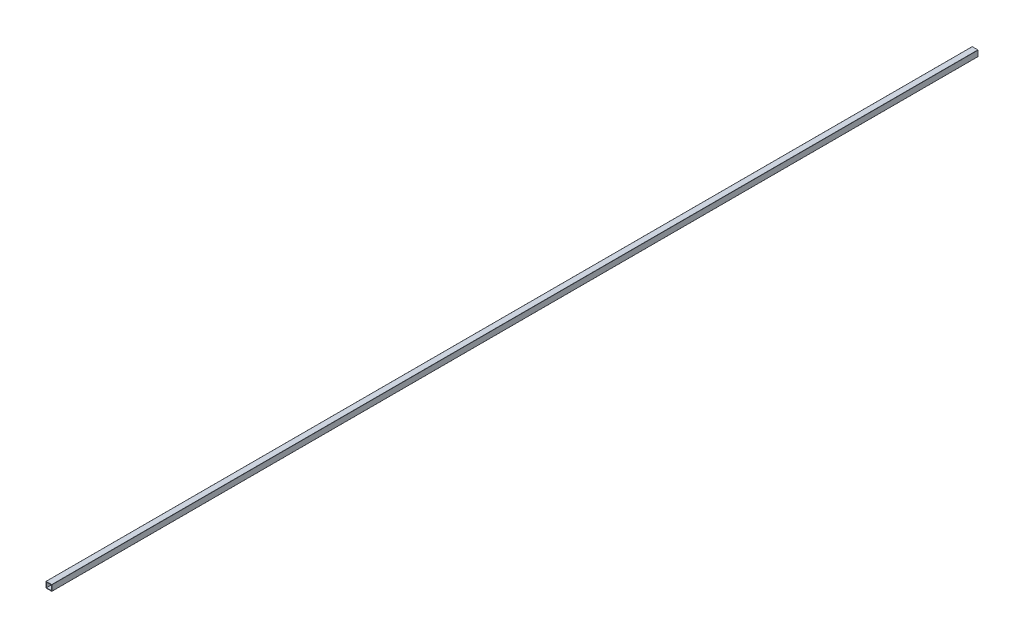
ISO-10303-21;
HEADER;
FILE_DESCRIPTION(('STEP AP214'),'2;1');
FILE_NAME('part.step','',(''),(''),'','','');
FILE_SCHEMA(('AUTOMOTIVE_DESIGN { 1 0 10303 214 1 1 1 1 }'));
ENDSEC;
DATA;
#1=APPLICATION_CONTEXT('core data for automotive mechanical design processes');
#2=APPLICATION_PROTOCOL_DEFINITION('international standard','automotive_design',2000,#1);
#3=PRODUCT_CONTEXT('',#1,'mechanical');
#4=PRODUCT('Part','Part','',(#3));
#5=PRODUCT_RELATED_PRODUCT_CATEGORY('part','',(#4));
#6=PRODUCT_DEFINITION_FORMATION('','',#4);
#7=PRODUCT_DEFINITION_CONTEXT('part definition',#1,'design');
#8=PRODUCT_DEFINITION('design','',#6,#7);
#9=PRODUCT_DEFINITION_SHAPE('','',#8);
#10=(LENGTH_UNIT() NAMED_UNIT(*) SI_UNIT(.MILLI.,.METRE.));
#11=(NAMED_UNIT(*) PLANE_ANGLE_UNIT() SI_UNIT($,.RADIAN.));
#12=(NAMED_UNIT(*) SI_UNIT($,.STERADIAN.) SOLID_ANGLE_UNIT());
#13=UNCERTAINTY_MEASURE_WITH_UNIT(LENGTH_MEASURE(1.E-05),#10,'distance_accuracy_value','');
#14=(GEOMETRIC_REPRESENTATION_CONTEXT(3) GLOBAL_UNCERTAINTY_ASSIGNED_CONTEXT((#13)) GLOBAL_UNIT_ASSIGNED_CONTEXT((#10,
#11,#12)) REPRESENTATION_CONTEXT('',''));
#15=CARTESIAN_POINT('',(0.,0.,0.));
#16=DIRECTION('',(0.,0.,1.));
#17=DIRECTION('',(1.,0.,0.));
#18=AXIS2_PLACEMENT_3D('',#15,#16,#17);
#19=CARTESIAN_POINT('',(18.05,18.05,6000.));
#20=DIRECTION('',(0.,0.,-1.));
#21=DIRECTION('',(-1.,0.,0.));
#22=AXIS2_PLACEMENT_3D('',#19,#20,#21);
#23=PLANE('',#22);
#24=CARTESIAN_POINT('',(18.05,18.05,6000.));
#25=DIRECTION('',(0.,0.,1.));
#26=DIRECTION('',(-1.,0.,0.));
#27=AXIS2_PLACEMENT_3D('',#24,#25,#26);
#28=CIRCLE('',#27,1.);
#29=CARTESIAN_POINT('',(19.05,18.05,6000.));
#30=VERTEX_POINT('',#29);
#31=CARTESIAN_POINT('',(18.05,19.05,6000.));
#32=VERTEX_POINT('',#31);
#33=EDGE_CURVE('E158',#30,#32,#28,.T.);
#34=ORIENTED_EDGE('',*,*,#33,.T.);
#35=DIRECTION('',(-1.,0.,0.));
#36=VECTOR('',#35,1.);
#37=CARTESIAN_POINT('',(-18.05,19.05,6000.));
#38=LINE('',#37,#36);
#39=CARTESIAN_POINT('',(-18.05,19.05,6000.));
#40=VERTEX_POINT('',#39);
#41=EDGE_CURVE('E161',#32,#40,#38,.T.);
#42=ORIENTED_EDGE('',*,*,#41,.T.);
#43=CARTESIAN_POINT('',(-18.05,18.05,6000.));
#44=DIRECTION('',(0.,0.,1.));
#45=DIRECTION('',(-1.,0.,0.));
#46=AXIS2_PLACEMENT_3D('',#43,#44,#45);
#47=CIRCLE('',#46,1.);
#48=CARTESIAN_POINT('',(-19.05,18.05,6000.));
#49=VERTEX_POINT('',#48);
#50=EDGE_CURVE('E164',#40,#49,#47,.T.);
#51=ORIENTED_EDGE('',*,*,#50,.T.);
#52=DIRECTION('',(0.,-1.,0.));
#53=VECTOR('',#52,1.);
#54=CARTESIAN_POINT('',(-19.05,-18.05,6000.));
#55=LINE('',#54,#53);
#56=CARTESIAN_POINT('',(-19.05,-18.05,6000.));
#57=VERTEX_POINT('',#56);
#58=EDGE_CURVE('E166',#49,#57,#55,.T.);
#59=ORIENTED_EDGE('',*,*,#58,.T.);
#60=CARTESIAN_POINT('',(-18.05,-18.05,6000.));
#61=DIRECTION('',(0.,0.,1.));
#62=DIRECTION('',(-1.,0.,0.));
#63=AXIS2_PLACEMENT_3D('',#60,#61,#62);
#64=CIRCLE('',#63,1.);
#65=CARTESIAN_POINT('',(-18.05,-19.05,6000.));
#66=VERTEX_POINT('',#65);
#67=EDGE_CURVE('E168',#57,#66,#64,.T.);
#68=ORIENTED_EDGE('',*,*,#67,.T.);
#69=DIRECTION('',(1.,0.,0.));
#70=VECTOR('',#69,1.);
#71=CARTESIAN_POINT('',(-18.05,-19.05,6000.));
#72=LINE('',#71,#70);
#73=CARTESIAN_POINT('',(18.05,-19.05,6000.));
#74=VERTEX_POINT('',#73);
#75=EDGE_CURVE('E170',#66,#74,#72,.T.);
#76=ORIENTED_EDGE('',*,*,#75,.T.);
#77=CARTESIAN_POINT('',(18.05,-18.05,6000.));
#78=DIRECTION('',(0.,0.,1.));
#79=DIRECTION('',(1.,0.,0.));
#80=AXIS2_PLACEMENT_3D('',#77,#78,#79);
#81=CIRCLE('',#80,1.);
#82=CARTESIAN_POINT('',(19.05,-18.05,6000.));
#83=VERTEX_POINT('',#82);
#84=EDGE_CURVE('E172',#74,#83,#81,.T.);
#85=ORIENTED_EDGE('',*,*,#84,.T.);
#86=DIRECTION('',(0.,1.,0.));
#87=VECTOR('',#86,1.);
#88=CARTESIAN_POINT('',(19.05,-18.05,6000.));
#89=LINE('',#88,#87);
#90=EDGE_CURVE('E174',#83,#30,#89,.T.);
#91=ORIENTED_EDGE('',*,*,#90,.T.);
#92=EDGE_LOOP('',(#34,#42,#51,#59,#68,#76,#85,#91));
#93=FACE_BOUND('',#92,.T.);
#94=DIRECTION('',(1.,0.,0.));
#95=VECTOR('',#94,1.);
#96=CARTESIAN_POINT('',(-16.01,-16.01,6000.));
#97=LINE('',#96,#95);
#98=CARTESIAN_POINT('',(-16.01,-16.01,6000.));
#99=VERTEX_POINT('',#98);
#100=CARTESIAN_POINT('',(16.01,-16.01,6000.));
#101=VERTEX_POINT('',#100);
#102=EDGE_CURVE('E122',#99,#101,#97,.T.);
#103=ORIENTED_EDGE('',*,*,#102,.F.);
#104=DIRECTION('',(0.,-1.,0.));
#105=VECTOR('',#104,1.);
#106=CARTESIAN_POINT('',(-16.01,-16.01,6000.));
#107=LINE('',#106,#105);
#108=CARTESIAN_POINT('',(-16.01,16.01,6000.));
#109=VERTEX_POINT('',#108);
#110=EDGE_CURVE('E144',#109,#99,#107,.T.);
#111=ORIENTED_EDGE('',*,*,#110,.F.);
#112=DIRECTION('',(-1.,0.,0.));
#113=VECTOR('',#112,1.);
#114=CARTESIAN_POINT('',(-16.01,16.01,6000.));
#115=LINE('',#114,#113);
#116=CARTESIAN_POINT('',(16.01,16.01,6000.));
#117=VERTEX_POINT('',#116);
#118=EDGE_CURVE('E142',#117,#109,#115,.T.);
#119=ORIENTED_EDGE('',*,*,#118,.F.);
#120=DIRECTION('',(0.,1.,0.));
#121=VECTOR('',#120,1.);
#122=CARTESIAN_POINT('',(16.01,-16.01,6000.));
#123=LINE('',#122,#121);
#124=EDGE_CURVE('E130',#101,#117,#123,.T.);
#125=ORIENTED_EDGE('',*,*,#124,.F.);
#126=EDGE_LOOP('',(#103,#111,#119,#125));
#127=FACE_BOUND('',#126,.T.);
#128=ADVANCED_FACE('F33',(#93,#127),#23,.F.);
#129=CARTESIAN_POINT('',(18.05,18.05,0.));
#130=DIRECTION('',(0.,0.,-1.));
#131=DIRECTION('',(-1.,0.,0.));
#132=AXIS2_PLACEMENT_3D('',#129,#130,#131);
#133=PLANE('',#132);
#134=CARTESIAN_POINT('',(18.05,18.05,0.));
#135=DIRECTION('',(0.,0.,1.));
#136=DIRECTION('',(-1.,0.,0.));
#137=AXIS2_PLACEMENT_3D('',#134,#135,#136);
#138=CIRCLE('',#137,1.);
#139=CARTESIAN_POINT('',(19.05,18.05,0.));
#140=VERTEX_POINT('',#139);
#141=CARTESIAN_POINT('',(18.05,19.05,0.));
#142=VERTEX_POINT('',#141);
#143=EDGE_CURVE('E138',#140,#142,#138,.T.);
#144=ORIENTED_EDGE('',*,*,#143,.F.);
#145=DIRECTION('',(0.,1.,0.));
#146=VECTOR('',#145,1.);
#147=CARTESIAN_POINT('',(19.05,-18.05,0.));
#148=LINE('',#147,#146);
#149=CARTESIAN_POINT('',(19.05,-18.05,0.));
#150=VERTEX_POINT('',#149);
#151=EDGE_CURVE('E162',#150,#140,#148,.T.);
#152=ORIENTED_EDGE('',*,*,#151,.F.);
#153=CARTESIAN_POINT('',(18.05,-18.05,0.));
#154=DIRECTION('',(0.,0.,1.));
#155=DIRECTION('',(1.,0.,0.));
#156=AXIS2_PLACEMENT_3D('',#153,#154,#155);
#157=CIRCLE('',#156,1.);
#158=CARTESIAN_POINT('',(18.05,-19.05,0.));
#159=VERTEX_POINT('',#158);
#160=EDGE_CURVE('E189',#159,#150,#157,.T.);
#161=ORIENTED_EDGE('',*,*,#160,.F.);
#162=DIRECTION('',(1.,0.,0.));
#163=VECTOR('',#162,1.);
#164=CARTESIAN_POINT('',(-18.05,-19.05,0.));
#165=LINE('',#164,#163);
#166=CARTESIAN_POINT('',(-18.05,-19.05,0.));
#167=VERTEX_POINT('',#166);
#168=EDGE_CURVE('E187',#167,#159,#165,.T.);
#169=ORIENTED_EDGE('',*,*,#168,.F.);
#170=CARTESIAN_POINT('',(-18.05,-18.05,0.));
#171=DIRECTION('',(0.,0.,1.));
#172=DIRECTION('',(-1.,0.,0.));
#173=AXIS2_PLACEMENT_3D('',#170,#171,#172);
#174=CIRCLE('',#173,1.);
#175=CARTESIAN_POINT('',(-19.05,-18.05,0.));
#176=VERTEX_POINT('',#175);
#177=EDGE_CURVE('E185',#176,#167,#174,.T.);
#178=ORIENTED_EDGE('',*,*,#177,.F.);
#179=DIRECTION('',(0.,-1.,0.));
#180=VECTOR('',#179,1.);
#181=CARTESIAN_POINT('',(-19.05,-18.05,0.));
#182=LINE('',#181,#180);
#183=CARTESIAN_POINT('',(-19.05,18.05,0.));
#184=VERTEX_POINT('',#183);
#185=EDGE_CURVE('E183',#184,#176,#182,.T.);
#186=ORIENTED_EDGE('',*,*,#185,.F.);
#187=CARTESIAN_POINT('',(-18.05,18.05,0.));
#188=DIRECTION('',(0.,0.,1.));
#189=DIRECTION('',(-1.,0.,0.));
#190=AXIS2_PLACEMENT_3D('',#187,#188,#189);
#191=CIRCLE('',#190,1.);
#192=CARTESIAN_POINT('',(-18.05,19.05,0.));
#193=VERTEX_POINT('',#192);
#194=EDGE_CURVE('E181',#193,#184,#191,.T.);
#195=ORIENTED_EDGE('',*,*,#194,.F.);
#196=DIRECTION('',(-1.,0.,0.));
#197=VECTOR('',#196,1.);
#198=CARTESIAN_POINT('',(-18.05,19.05,0.));
#199=LINE('',#198,#197);
#200=EDGE_CURVE('E179',#142,#193,#199,.T.);
#201=ORIENTED_EDGE('',*,*,#200,.F.);
#202=EDGE_LOOP('',(#144,#152,#161,#169,#178,#186,#195,#201));
#203=FACE_BOUND('',#202,.T.);
#204=DIRECTION('',(0.,-1.,0.));
#205=VECTOR('',#204,1.);
#206=CARTESIAN_POINT('',(-16.01,-16.01,0.));
#207=LINE('',#206,#205);
#208=CARTESIAN_POINT('',(-16.01,16.01,0.));
#209=VERTEX_POINT('',#208);
#210=CARTESIAN_POINT('',(-16.01,-16.01,0.));
#211=VERTEX_POINT('',#210);
#212=EDGE_CURVE('E131',#209,#211,#207,.T.);
#213=ORIENTED_EDGE('',*,*,#212,.T.);
#214=DIRECTION('',(1.,0.,0.));
#215=VECTOR('',#214,1.);
#216=CARTESIAN_POINT('',(-16.01,-16.01,0.));
#217=LINE('',#216,#215);
#218=CARTESIAN_POINT('',(16.01,-16.01,0.));
#219=VERTEX_POINT('',#218);
#220=EDGE_CURVE('E56',#211,#219,#217,.T.);
#221=ORIENTED_EDGE('',*,*,#220,.T.);
#222=DIRECTION('',(0.,1.,0.));
#223=VECTOR('',#222,1.);
#224=CARTESIAN_POINT('',(16.01,-16.01,0.));
#225=LINE('',#224,#223);
#226=CARTESIAN_POINT('',(16.01,16.01,0.));
#227=VERTEX_POINT('',#226);
#228=EDGE_CURVE('E137',#219,#227,#225,.T.);
#229=ORIENTED_EDGE('',*,*,#228,.T.);
#230=DIRECTION('',(-1.,0.,0.));
#231=VECTOR('',#230,1.);
#232=CARTESIAN_POINT('',(-16.01,16.01,0.));
#233=LINE('',#232,#231);
#234=EDGE_CURVE('E150',#227,#209,#233,.T.);
#235=ORIENTED_EDGE('',*,*,#234,.T.);
#236=EDGE_LOOP('',(#213,#221,#229,#235));
#237=FACE_BOUND('',#236,.T.);
#238=ADVANCED_FACE('F219',(#203,#237),#133,.T.);
#239=CARTESIAN_POINT('',(18.05,18.05,6000.));
#240=DIRECTION('',(0.,0.,-1.));
#241=DIRECTION('',(-1.,0.,0.));
#242=AXIS2_PLACEMENT_3D('',#239,#240,#241);
#243=CYLINDRICAL_SURFACE('',#242,1.);
#244=ORIENTED_EDGE('',*,*,#143,.T.);
#245=DIRECTION('',(0.,0.,-1.));
#246=VECTOR('',#245,1.);
#247=CARTESIAN_POINT('',(18.05,19.05,6000.));
#248=LINE('',#247,#246);
#249=EDGE_CURVE('E11',#32,#142,#248,.T.);
#250=ORIENTED_EDGE('',*,*,#249,.F.);
#251=ORIENTED_EDGE('',*,*,#33,.F.);
#252=DIRECTION('',(0.,0.,-1.));
#253=VECTOR('',#252,1.);
#254=CARTESIAN_POINT('',(19.05,18.05,6000.));
#255=LINE('',#254,#253);
#256=EDGE_CURVE('E176',#30,#140,#255,.T.);
#257=ORIENTED_EDGE('',*,*,#256,.T.);
#258=EDGE_LOOP('',(#244,#250,#251,#257));
#259=FACE_BOUND('',#258,.T.);
#260=ADVANCED_FACE('F35',(#259),#243,.T.);
#261=CARTESIAN_POINT('',(-18.05,19.05,6000.));
#262=DIRECTION('',(0.,-1.,0.));
#263=DIRECTION('',(0.,0.,-1.));
#264=AXIS2_PLACEMENT_3D('',#261,#262,#263);
#265=PLANE('',#264);
#266=ORIENTED_EDGE('',*,*,#200,.T.);
#267=DIRECTION('',(0.,0.,-1.));
#268=VECTOR('',#267,1.);
#269=CARTESIAN_POINT('',(-18.05,19.05,6000.));
#270=LINE('',#269,#268);
#271=EDGE_CURVE('E41',#40,#193,#270,.T.);
#272=ORIENTED_EDGE('',*,*,#271,.F.);
#273=ORIENTED_EDGE('',*,*,#41,.F.);
#274=ORIENTED_EDGE('',*,*,#249,.T.);
#275=EDGE_LOOP('',(#266,#272,#273,#274));
#276=FACE_BOUND('',#275,.T.);
#277=ADVANCED_FACE('F236',(#276),#265,.F.);
#278=CARTESIAN_POINT('',(-18.05,18.05,6000.));
#279=DIRECTION('',(0.,0.,-1.));
#280=DIRECTION('',(-1.,0.,0.));
#281=AXIS2_PLACEMENT_3D('',#278,#279,#280);
#282=CYLINDRICAL_SURFACE('',#281,1.);
#283=ORIENTED_EDGE('',*,*,#194,.T.);
#284=DIRECTION('',(0.,0.,-1.));
#285=VECTOR('',#284,1.);
#286=CARTESIAN_POINT('',(-19.05,18.05,6000.));
#287=LINE('',#286,#285);
#288=EDGE_CURVE('E206',#49,#184,#287,.T.);
#289=ORIENTED_EDGE('',*,*,#288,.F.);
#290=ORIENTED_EDGE('',*,*,#50,.F.);
#291=ORIENTED_EDGE('',*,*,#271,.T.);
#292=EDGE_LOOP('',(#283,#289,#290,#291));
#293=FACE_BOUND('',#292,.T.);
#294=ADVANCED_FACE('F213',(#293),#282,.T.);
#295=CARTESIAN_POINT('',(-19.05,-18.05,6000.));
#296=DIRECTION('',(1.,0.,0.));
#297=DIRECTION('',(0.,0.,-1.));
#298=AXIS2_PLACEMENT_3D('',#295,#296,#297);
#299=PLANE('',#298);
#300=ORIENTED_EDGE('',*,*,#185,.T.);
#301=DIRECTION('',(0.,0.,-1.));
#302=VECTOR('',#301,1.);
#303=CARTESIAN_POINT('',(-19.05,-18.05,6000.));
#304=LINE('',#303,#302);
#305=EDGE_CURVE('E203',#57,#176,#304,.T.);
#306=ORIENTED_EDGE('',*,*,#305,.F.);
#307=ORIENTED_EDGE('',*,*,#58,.F.);
#308=ORIENTED_EDGE('',*,*,#288,.T.);
#309=EDGE_LOOP('',(#300,#306,#307,#308));
#310=FACE_BOUND('',#309,.T.);
#311=ADVANCED_FACE('F225',(#310),#299,.F.);
#312=CARTESIAN_POINT('',(-18.05,-18.05,6000.));
#313=DIRECTION('',(0.,0.,-1.));
#314=DIRECTION('',(-1.,0.,0.));
#315=AXIS2_PLACEMENT_3D('',#312,#313,#314);
#316=CYLINDRICAL_SURFACE('',#315,1.);
#317=ORIENTED_EDGE('',*,*,#177,.T.);
#318=DIRECTION('',(0.,0.,-1.));
#319=VECTOR('',#318,1.);
#320=CARTESIAN_POINT('',(-18.05,-19.05,6000.));
#321=LINE('',#320,#319);
#322=EDGE_CURVE('E200',#66,#167,#321,.T.);
#323=ORIENTED_EDGE('',*,*,#322,.F.);
#324=ORIENTED_EDGE('',*,*,#67,.F.);
#325=ORIENTED_EDGE('',*,*,#305,.T.);
#326=EDGE_LOOP('',(#317,#323,#324,#325));
#327=FACE_BOUND('',#326,.T.);
#328=ADVANCED_FACE('F229',(#327),#316,.T.);
#329=CARTESIAN_POINT('',(-18.05,-19.05,6000.));
#330=DIRECTION('',(0.,1.,0.));
#331=DIRECTION('',(0.,0.,1.));
#332=AXIS2_PLACEMENT_3D('',#329,#330,#331);
#333=PLANE('',#332);
#334=ORIENTED_EDGE('',*,*,#168,.T.);
#335=DIRECTION('',(0.,0.,-1.));
#336=VECTOR('',#335,1.);
#337=CARTESIAN_POINT('',(18.05,-19.05,6000.));
#338=LINE('',#337,#336);
#339=EDGE_CURVE('E197',#74,#159,#338,.T.);
#340=ORIENTED_EDGE('',*,*,#339,.F.);
#341=ORIENTED_EDGE('',*,*,#75,.F.);
#342=ORIENTED_EDGE('',*,*,#322,.T.);
#343=EDGE_LOOP('',(#334,#340,#341,#342));
#344=FACE_BOUND('',#343,.T.);
#345=ADVANCED_FACE('F249',(#344),#333,.F.);
#346=CARTESIAN_POINT('',(18.05,-18.05,6000.));
#347=DIRECTION('',(0.,0.,-1.));
#348=DIRECTION('',(-1.,0.,0.));
#349=AXIS2_PLACEMENT_3D('',#346,#347,#348);
#350=CYLINDRICAL_SURFACE('',#349,1.);
#351=ORIENTED_EDGE('',*,*,#160,.T.);
#352=DIRECTION('',(0.,0.,-1.));
#353=VECTOR('',#352,1.);
#354=CARTESIAN_POINT('',(19.05,-18.05,6000.));
#355=LINE('',#354,#353);
#356=EDGE_CURVE('E194',#83,#150,#355,.T.);
#357=ORIENTED_EDGE('',*,*,#356,.F.);
#358=ORIENTED_EDGE('',*,*,#84,.F.);
#359=ORIENTED_EDGE('',*,*,#339,.T.);
#360=EDGE_LOOP('',(#351,#357,#358,#359));
#361=FACE_BOUND('',#360,.T.);
#362=ADVANCED_FACE('F247',(#361),#350,.T.);
#363=CARTESIAN_POINT('',(19.05,-18.05,6000.));
#364=DIRECTION('',(-1.,0.,0.));
#365=DIRECTION('',(0.,0.,1.));
#366=AXIS2_PLACEMENT_3D('',#363,#364,#365);
#367=PLANE('',#366);
#368=ORIENTED_EDGE('',*,*,#151,.T.);
#369=ORIENTED_EDGE('',*,*,#256,.F.);
#370=ORIENTED_EDGE('',*,*,#90,.F.);
#371=ORIENTED_EDGE('',*,*,#356,.T.);
#372=EDGE_LOOP('',(#368,#369,#370,#371));
#373=FACE_BOUND('',#372,.T.);
#374=ADVANCED_FACE('F242',(#373),#367,.F.);
#375=CARTESIAN_POINT('',(-16.01,-16.01,6000.));
#376=DIRECTION('',(0.,1.,0.));
#377=DIRECTION('',(0.,0.,1.));
#378=AXIS2_PLACEMENT_3D('',#375,#376,#377);
#379=PLANE('',#378);
#380=ORIENTED_EDGE('',*,*,#220,.F.);
#381=DIRECTION('',(0.,0.,-1.));
#382=VECTOR('',#381,1.);
#383=CARTESIAN_POINT('',(-16.01,-16.01,6000.));
#384=LINE('',#383,#382);
#385=EDGE_CURVE('E126',#99,#211,#384,.T.);
#386=ORIENTED_EDGE('',*,*,#385,.F.);
#387=ORIENTED_EDGE('',*,*,#102,.T.);
#388=DIRECTION('',(0.,0.,-1.));
#389=VECTOR('',#388,1.);
#390=CARTESIAN_POINT('',(16.01,-16.01,6000.));
#391=LINE('',#390,#389);
#392=EDGE_CURVE('E125',#101,#219,#391,.T.);
#393=ORIENTED_EDGE('',*,*,#392,.T.);
#394=EDGE_LOOP('',(#380,#386,#387,#393));
#395=FACE_BOUND('',#394,.T.);
#396=ADVANCED_FACE('F124',(#395),#379,.T.);
#397=CARTESIAN_POINT('',(16.01,-16.01,6000.));
#398=DIRECTION('',(-1.,0.,0.));
#399=DIRECTION('',(0.,-1.,0.));
#400=AXIS2_PLACEMENT_3D('',#397,#398,#399);
#401=PLANE('',#400);
#402=ORIENTED_EDGE('',*,*,#228,.F.);
#403=ORIENTED_EDGE('',*,*,#392,.F.);
#404=ORIENTED_EDGE('',*,*,#124,.T.);
#405=DIRECTION('',(0.,0.,-1.));
#406=VECTOR('',#405,1.);
#407=CARTESIAN_POINT('',(16.01,16.01,6000.));
#408=LINE('',#407,#406);
#409=EDGE_CURVE('E139',#117,#227,#408,.T.);
#410=ORIENTED_EDGE('',*,*,#409,.T.);
#411=EDGE_LOOP('',(#402,#403,#404,#410));
#412=FACE_BOUND('',#411,.T.);
#413=ADVANCED_FACE('F134',(#412),#401,.T.);
#414=CARTESIAN_POINT('',(-16.01,16.01,6000.));
#415=DIRECTION('',(0.,-1.,0.));
#416=DIRECTION('',(1.,0.,0.));
#417=AXIS2_PLACEMENT_3D('',#414,#415,#416);
#418=PLANE('',#417);
#419=ORIENTED_EDGE('',*,*,#234,.F.);
#420=ORIENTED_EDGE('',*,*,#409,.F.);
#421=ORIENTED_EDGE('',*,*,#118,.T.);
#422=DIRECTION('',(0.,0.,-1.));
#423=VECTOR('',#422,1.);
#424=CARTESIAN_POINT('',(-16.01,16.01,6000.));
#425=LINE('',#424,#423);
#426=EDGE_CURVE('E48',#109,#209,#425,.T.);
#427=ORIENTED_EDGE('',*,*,#426,.T.);
#428=EDGE_LOOP('',(#419,#420,#421,#427));
#429=FACE_BOUND('',#428,.T.);
#430=ADVANCED_FACE('F274',(#429),#418,.T.);
#431=CARTESIAN_POINT('',(-16.01,-16.01,6000.));
#432=DIRECTION('',(1.,0.,0.));
#433=DIRECTION('',(0.,0.,-1.));
#434=AXIS2_PLACEMENT_3D('',#431,#432,#433);
#435=PLANE('',#434);
#436=ORIENTED_EDGE('',*,*,#212,.F.);
#437=ORIENTED_EDGE('',*,*,#426,.F.);
#438=ORIENTED_EDGE('',*,*,#110,.T.);
#439=ORIENTED_EDGE('',*,*,#385,.T.);
#440=EDGE_LOOP('',(#436,#437,#438,#439));
#441=FACE_BOUND('',#440,.T.);
#442=ADVANCED_FACE('F278',(#441),#435,.T.);
#443=CLOSED_SHELL('',(#128,#238,#260,#277,#294,#311,#328,#345,#362,#374,#396,#413,#430,#442));
#444=MANIFOLD_SOLID_BREP('B2',#443);
#445=ADVANCED_BREP_SHAPE_REPRESENTATION('',(#18,#444),#14);
#446=SHAPE_DEFINITION_REPRESENTATION(#9,#445);
ENDSEC;
END-ISO-10303-21;
